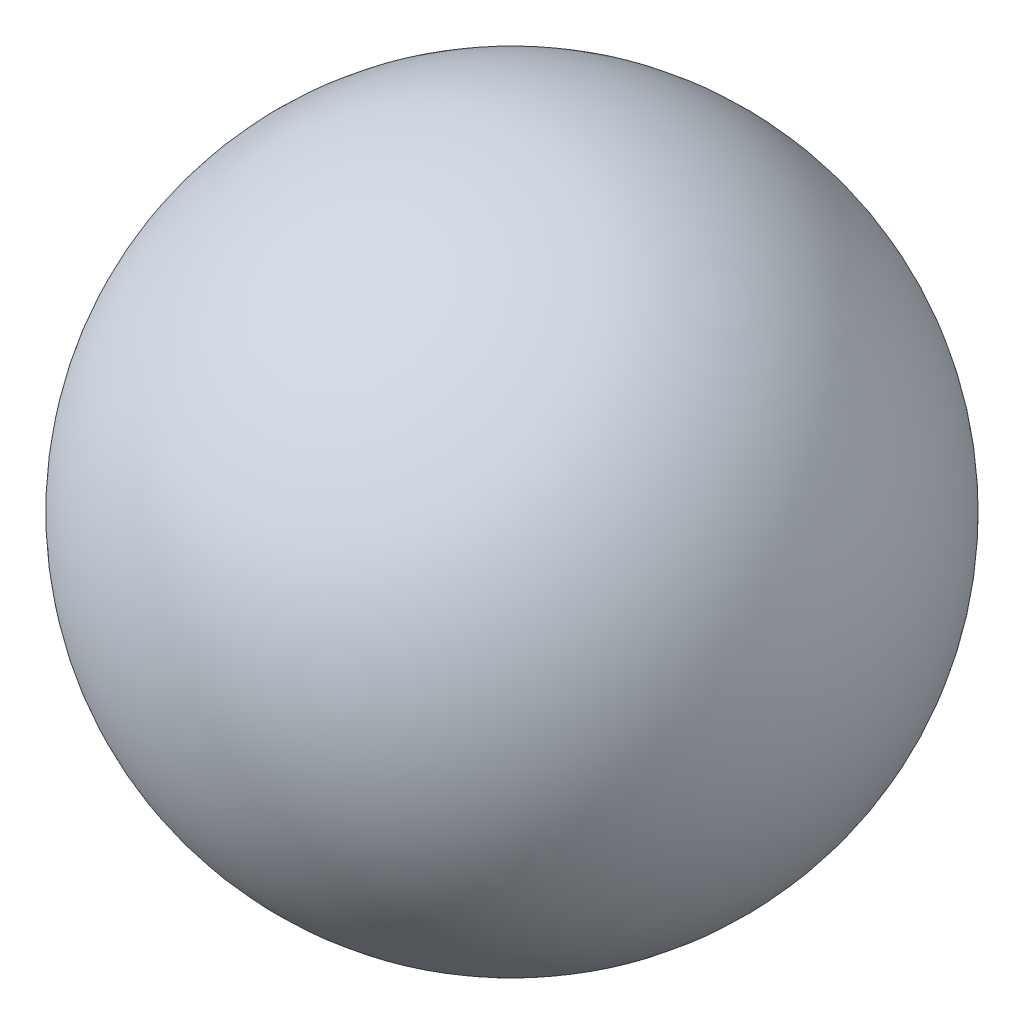
ISO-10303-21;
HEADER;
FILE_DESCRIPTION(('STEP AP214'),'2;1');
FILE_NAME('part.step','',(''),(''),'','','');
FILE_SCHEMA(('AUTOMOTIVE_DESIGN { 1 0 10303 214 1 1 1 1 }'));
ENDSEC;
DATA;
#1=APPLICATION_CONTEXT('core data for automotive mechanical design processes');
#2=APPLICATION_PROTOCOL_DEFINITION('international standard','automotive_design',2000,#1);
#3=PRODUCT_CONTEXT('',#1,'mechanical');
#4=PRODUCT('Part','Part','',(#3));
#5=PRODUCT_RELATED_PRODUCT_CATEGORY('part','',(#4));
#6=PRODUCT_DEFINITION_FORMATION('','',#4);
#7=PRODUCT_DEFINITION_CONTEXT('part definition',#1,'design');
#8=PRODUCT_DEFINITION('design','',#6,#7);
#9=PRODUCT_DEFINITION_SHAPE('','',#8);
#10=(LENGTH_UNIT() NAMED_UNIT(*) SI_UNIT(.MILLI.,.METRE.));
#11=(NAMED_UNIT(*) PLANE_ANGLE_UNIT() SI_UNIT($,.RADIAN.));
#12=(NAMED_UNIT(*) SI_UNIT($,.STERADIAN.) SOLID_ANGLE_UNIT());
#13=UNCERTAINTY_MEASURE_WITH_UNIT(LENGTH_MEASURE(1.E-05),#10,'distance_accuracy_value','');
#14=(GEOMETRIC_REPRESENTATION_CONTEXT(3) GLOBAL_UNCERTAINTY_ASSIGNED_CONTEXT((#13)) GLOBAL_UNIT_ASSIGNED_CONTEXT((#10,
#11,#12)) REPRESENTATION_CONTEXT('',''));
#15=CARTESIAN_POINT('',(0.,0.,0.));
#16=DIRECTION('',(0.,0.,1.));
#17=DIRECTION('',(1.,0.,0.));
#18=AXIS2_PLACEMENT_3D('',#15,#16,#17);
#19=CARTESIAN_POINT('',(0.,0.,0.));
#20=DIRECTION('',(0.,-1.,0.));
#21=DIRECTION('',(-1.,0.,0.));
#22=AXIS2_PLACEMENT_3D('',#19,#20,#21);
#23=SPHERICAL_SURFACE('',#22,18.5);
#24=CARTESIAN_POINT('',(0.,-18.5,0.));
#25=VERTEX_POINT('',#24);
#26=VERTEX_LOOP('',#25);
#27=FACE_BOUND('',#26,.T.);
#28=ADVANCED_FACE('F33',(#27),#23,.T.);
#29=CLOSED_SHELL('',(#28));
#30=MANIFOLD_SOLID_BREP('B2',#29);
#31=ADVANCED_BREP_SHAPE_REPRESENTATION('',(#18,#30),#14);
#32=SHAPE_DEFINITION_REPRESENTATION(#9,#31);
ENDSEC;
END-ISO-10303-21;
